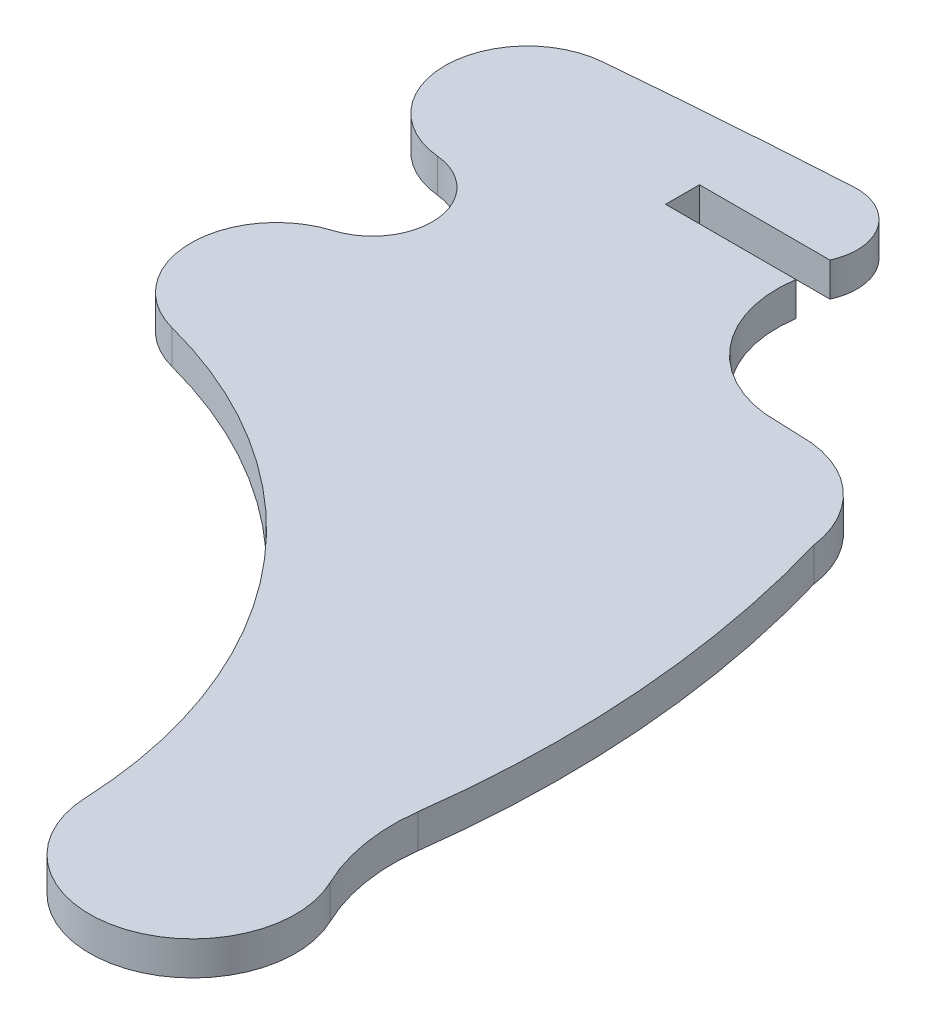
ISO-10303-21;
HEADER;
FILE_DESCRIPTION(('STEP AP214'),'2;1');
FILE_NAME('part.step','',(''),(''),'','','');
FILE_SCHEMA(('AUTOMOTIVE_DESIGN { 1 0 10303 214 1 1 1 1 }'));
ENDSEC;
DATA;
#1=APPLICATION_CONTEXT('core data for automotive mechanical design processes');
#2=APPLICATION_PROTOCOL_DEFINITION('international standard','automotive_design',2000,#1);
#3=PRODUCT_CONTEXT('',#1,'mechanical');
#4=PRODUCT('Part','Part','',(#3));
#5=PRODUCT_RELATED_PRODUCT_CATEGORY('part','',(#4));
#6=PRODUCT_DEFINITION_FORMATION('','',#4);
#7=PRODUCT_DEFINITION_CONTEXT('part definition',#1,'design');
#8=PRODUCT_DEFINITION('design','',#6,#7);
#9=PRODUCT_DEFINITION_SHAPE('','',#8);
#10=(LENGTH_UNIT() NAMED_UNIT(*) SI_UNIT(.MILLI.,.METRE.));
#11=(NAMED_UNIT(*) PLANE_ANGLE_UNIT() SI_UNIT($,.RADIAN.));
#12=(NAMED_UNIT(*) SI_UNIT($,.STERADIAN.) SOLID_ANGLE_UNIT());
#13=UNCERTAINTY_MEASURE_WITH_UNIT(LENGTH_MEASURE(1.E-05),#10,'distance_accuracy_value','');
#14=(GEOMETRIC_REPRESENTATION_CONTEXT(3) GLOBAL_UNCERTAINTY_ASSIGNED_CONTEXT((#13)) GLOBAL_UNIT_ASSIGNED_CONTEXT((#10,
#11,#12)) REPRESENTATION_CONTEXT('',''));
#15=CARTESIAN_POINT('',(0.,0.,0.));
#16=DIRECTION('',(0.,0.,1.));
#17=DIRECTION('',(1.,0.,0.));
#18=AXIS2_PLACEMENT_3D('',#15,#16,#17);
#19=CARTESIAN_POINT('',(-41930.5782253417,3.,-18255.2247567297));
#20=DIRECTION('',(0.,-1.,0.));
#21=DIRECTION('',(0.,0.,-1.));
#22=AXIS2_PLACEMENT_3D('',#19,#20,#21);
#23=CYLINDRICAL_SURFACE('',#22,4.69438040440287);
#24=CARTESIAN_POINT('',(-41930.5782253417,0.,-18255.2247567297));
#25=DIRECTION('',(0.,1.,0.));
#26=DIRECTION('',(0.,0.,1.));
#27=AXIS2_PLACEMENT_3D('',#24,#25,#26);
#28=CIRCLE('',#27,4.69438040440287);
#29=CARTESIAN_POINT('',(-41926.320312,0.,-18253.248047));
#30=VERTEX_POINT('',#29);
#31=CARTESIAN_POINT('',(-41930.847201,0.,-18259.9114250001));
#32=VERTEX_POINT('',#31);
#33=EDGE_CURVE('E173',#30,#32,#28,.T.);
#34=ORIENTED_EDGE('',*,*,#33,.T.);
#35=DIRECTION('',(0.,-1.,0.));
#36=VECTOR('',#35,1.);
#37=CARTESIAN_POINT('',(-41930.847201,3.,-18259.9114250001));
#38=LINE('',#37,#36);
#39=CARTESIAN_POINT('',(-41930.847201,3.,-18259.9114250001));
#40=VERTEX_POINT('',#39);
#41=EDGE_CURVE('E11',#40,#32,#38,.T.);
#42=ORIENTED_EDGE('',*,*,#41,.F.);
#43=CARTESIAN_POINT('',(-41930.5782253417,3.,-18255.2247567297));
#44=DIRECTION('',(0.,1.,0.));
#45=DIRECTION('',(0.,0.,1.));
#46=AXIS2_PLACEMENT_3D('',#43,#44,#45);
#47=CIRCLE('',#46,4.69438040440287);
#48=CARTESIAN_POINT('',(-41926.320312,3.,-18253.248047));
#49=VERTEX_POINT('',#48);
#50=EDGE_CURVE('E201',#49,#40,#47,.T.);
#51=ORIENTED_EDGE('',*,*,#50,.F.);
#52=DIRECTION('',(0.,-1.,0.));
#53=VECTOR('',#52,1.);
#54=CARTESIAN_POINT('',(-41926.320312,3.,-18253.248047));
#55=LINE('',#54,#53);
#56=EDGE_CURVE('E169',#49,#30,#55,.T.);
#57=ORIENTED_EDGE('',*,*,#56,.T.);
#58=EDGE_LOOP('',(#34,#42,#51,#57));
#59=FACE_BOUND('',#58,.T.);
#60=ADVANCED_FACE('F35',(#59),#23,.T.);
#61=CARTESIAN_POINT('',(-41892.5390600243,3.,-17595.9492191451));
#62=DIRECTION('',(0.,-1.,0.));
#63=DIRECTION('',(0.,0.,-1.));
#64=AXIS2_PLACEMENT_3D('',#61,#62,#63);
#65=CYLINDRICAL_SURFACE('',#64,665.066406059401);
#66=CARTESIAN_POINT('',(-41892.5390600243,0.,-17595.9492191451));
#67=DIRECTION('',(0.,1.,0.));
#68=DIRECTION('',(0.,0.,1.));
#69=AXIS2_PLACEMENT_3D('',#66,#67,#68);
#70=CIRCLE('',#69,665.066406059401);
#71=CARTESIAN_POINT('',(-41951.6236900002,0.,-18258.385881));
#72=VERTEX_POINT('',#71);
#73=EDGE_CURVE('E176',#32,#72,#70,.T.);
#74=ORIENTED_EDGE('',*,*,#73,.T.);
#75=DIRECTION('',(0.,-1.,0.));
#76=VECTOR('',#75,1.);
#77=CARTESIAN_POINT('',(-41951.6236900002,3.,-18258.385881));
#78=LINE('',#77,#76);
#79=CARTESIAN_POINT('',(-41951.6236900002,3.,-18258.385881));
#80=VERTEX_POINT('',#79);
#81=EDGE_CURVE('E43',#80,#72,#78,.T.);
#82=ORIENTED_EDGE('',*,*,#81,.F.);
#83=CARTESIAN_POINT('',(-41892.5390600243,3.,-17595.9492191451));
#84=DIRECTION('',(0.,1.,0.));
#85=DIRECTION('',(0.,0.,1.));
#86=AXIS2_PLACEMENT_3D('',#83,#84,#85);
#87=CIRCLE('',#86,665.066406059401);
#88=EDGE_CURVE('E115',#40,#80,#87,.T.);
#89=ORIENTED_EDGE('',*,*,#88,.F.);
#90=ORIENTED_EDGE('',*,*,#41,.T.);
#91=EDGE_LOOP('',(#74,#82,#89,#90));
#92=FACE_BOUND('',#91,.T.);
#93=ADVANCED_FACE('F294',(#92),#65,.T.);
#94=CARTESIAN_POINT('',(-41950.9765596597,3.,-18251.1102450036));
#95=DIRECTION('',(0.,-1.,0.));
#96=DIRECTION('',(0.,0.,-1.));
#97=AXIS2_PLACEMENT_3D('',#94,#95,#96);
#98=CYLINDRICAL_SURFACE('',#97,7.30435875549886);
#99=CARTESIAN_POINT('',(-41950.9765596597,0.,-18251.1102450036));
#100=DIRECTION('',(0.,1.,0.));
#101=DIRECTION('',(0.,0.,1.));
#102=AXIS2_PLACEMENT_3D('',#99,#100,#101);
#103=CIRCLE('',#102,7.30435875549886);
#104=CARTESIAN_POINT('',(-41951.662825,0.,-18243.8381959999));
#105=VERTEX_POINT('',#104);
#106=EDGE_CURVE('E178',#72,#105,#103,.T.);
#107=ORIENTED_EDGE('',*,*,#106,.T.);
#108=DIRECTION('',(0.,-1.,0.));
#109=VECTOR('',#108,1.);
#110=CARTESIAN_POINT('',(-41951.662825,3.,-18243.8381959999));
#111=LINE('',#110,#109);
#112=CARTESIAN_POINT('',(-41951.662825,3.,-18243.8381959999));
#113=VERTEX_POINT('',#112);
#114=EDGE_CURVE('E229',#113,#105,#111,.T.);
#115=ORIENTED_EDGE('',*,*,#114,.F.);
#116=CARTESIAN_POINT('',(-41950.9765596597,3.,-18251.1102450036));
#117=DIRECTION('',(0.,1.,0.));
#118=DIRECTION('',(0.,0.,1.));
#119=AXIS2_PLACEMENT_3D('',#116,#117,#118);
#120=CIRCLE('',#119,7.30435875549886);
#121=EDGE_CURVE('E237',#80,#113,#120,.T.);
#122=ORIENTED_EDGE('',*,*,#121,.F.);
#123=ORIENTED_EDGE('',*,*,#81,.T.);
#124=EDGE_LOOP('',(#107,#115,#122,#123));
#125=FACE_BOUND('',#124,.T.);
#126=ADVANCED_FACE('F235',(#125),#98,.T.);
#127=CARTESIAN_POINT('',(-41952.1601470307,3.,-18238.5604603323));
#128=DIRECTION('',(0.,-1.,0.));
#129=DIRECTION('',(0.,0.,-1.));
#130=AXIS2_PLACEMENT_3D('',#127,#128,#129);
#131=CYLINDRICAL_SURFACE('',#130,5.30111525815377);
#132=CARTESIAN_POINT('',(-41952.1601470307,0.,-18238.5604603323));
#133=DIRECTION('',(0.,-1.,0.));
#134=DIRECTION('',(0.,0.,1.));
#135=AXIS2_PLACEMENT_3D('',#132,#133,#134);
#136=CIRCLE('',#135,5.30111525815377);
#137=CARTESIAN_POINT('',(-41950.592544,0.,-18233.496426));
#138=VERTEX_POINT('',#137);
#139=EDGE_CURVE('E180',#105,#138,#136,.T.);
#140=ORIENTED_EDGE('',*,*,#139,.T.);
#141=DIRECTION('',(0.,-1.,0.));
#142=VECTOR('',#141,1.);
#143=CARTESIAN_POINT('',(-41950.592544,3.,-18233.496426));
#144=LINE('',#143,#142);
#145=CARTESIAN_POINT('',(-41950.592544,3.,-18233.496426));
#146=VERTEX_POINT('',#145);
#147=EDGE_CURVE('E226',#146,#138,#144,.T.);
#148=ORIENTED_EDGE('',*,*,#147,.F.);
#149=CARTESIAN_POINT('',(-41952.1601470307,3.,-18238.5604603323));
#150=DIRECTION('',(0.,-1.,0.));
#151=DIRECTION('',(0.,0.,1.));
#152=AXIS2_PLACEMENT_3D('',#149,#150,#151);
#153=CIRCLE('',#152,5.30111525815377);
#154=EDGE_CURVE('E255',#113,#146,#153,.T.);
#155=ORIENTED_EDGE('',*,*,#154,.F.);
#156=ORIENTED_EDGE('',*,*,#114,.T.);
#157=EDGE_LOOP('',(#140,#148,#155,#156));
#158=FACE_BOUND('',#157,.T.);
#159=ADVANCED_FACE('F246',(#158),#131,.F.);
#160=CARTESIAN_POINT('',(-41948.3554161134,3.,-18226.2534466507));
#161=DIRECTION('',(0.,-1.,0.));
#162=DIRECTION('',(0.,0.,-1.));
#163=AXIS2_PLACEMENT_3D('',#160,#161,#162);
#164=CYLINDRICAL_SURFACE('',#163,7.58059964880303);
#165=CARTESIAN_POINT('',(-41948.3554161134,0.,-18226.2534466507));
#166=DIRECTION('',(0.,1.,0.));
#167=DIRECTION('',(0.,0.,1.));
#168=AXIS2_PLACEMENT_3D('',#165,#166,#167);
#169=CIRCLE('',#168,7.58059964880303);
#170=CARTESIAN_POINT('',(-41950.272967,0.,-18218.919383));
#171=VERTEX_POINT('',#170);
#172=EDGE_CURVE('E182',#138,#171,#169,.T.);
#173=ORIENTED_EDGE('',*,*,#172,.T.);
#174=DIRECTION('',(0.,-1.,0.));
#175=VECTOR('',#174,1.);
#176=CARTESIAN_POINT('',(-41950.272967,3.,-18218.919383));
#177=LINE('',#176,#175);
#178=CARTESIAN_POINT('',(-41950.272967,3.,-18218.919383));
#179=VERTEX_POINT('',#178);
#180=EDGE_CURVE('E223',#179,#171,#177,.T.);
#181=ORIENTED_EDGE('',*,*,#180,.F.);
#182=CARTESIAN_POINT('',(-41948.3554161134,3.,-18226.2534466507));
#183=DIRECTION('',(0.,1.,0.));
#184=DIRECTION('',(0.,0.,1.));
#185=AXIS2_PLACEMENT_3D('',#182,#183,#184);
#186=CIRCLE('',#185,7.58059964880303);
#187=EDGE_CURVE('E252',#146,#179,#186,.T.);
#188=ORIENTED_EDGE('',*,*,#187,.F.);
#189=ORIENTED_EDGE('',*,*,#147,.T.);
#190=EDGE_LOOP('',(#173,#181,#188,#189));
#191=FACE_BOUND('',#190,.T.);
#192=ADVANCED_FACE('F250',(#191),#164,.T.);
#193=CARTESIAN_POINT('',(-41961.1957392201,3.,-18177.117716044));
#194=DIRECTION('',(0.,-1.,0.));
#195=DIRECTION('',(0.,0.,-1.));
#196=AXIS2_PLACEMENT_3D('',#193,#194,#195);
#197=CYLINDRICAL_SURFACE('',#196,43.205165354029);
#198=CARTESIAN_POINT('',(-41961.1957392201,0.,-18177.117716044));
#199=DIRECTION('',(0.,-1.,0.));
#200=DIRECTION('',(0.,0.,1.));
#201=AXIS2_PLACEMENT_3D('',#198,#199,#200);
#202=CIRCLE('',#201,43.205165354029);
#203=CARTESIAN_POINT('',(-41918.0313,0.,-18178.9932159999));
#204=VERTEX_POINT('',#203);
#205=EDGE_CURVE('E184',#171,#204,#202,.T.);
#206=ORIENTED_EDGE('',*,*,#205,.T.);
#207=DIRECTION('',(0.,-1.,0.));
#208=VECTOR('',#207,1.);
#209=CARTESIAN_POINT('',(-41918.0313,3.,-18178.9932159999));
#210=LINE('',#209,#208);
#211=CARTESIAN_POINT('',(-41918.0313,3.,-18178.9932159999));
#212=VERTEX_POINT('',#211);
#213=EDGE_CURVE('E220',#212,#204,#210,.T.);
#214=ORIENTED_EDGE('',*,*,#213,.F.);
#215=CARTESIAN_POINT('',(-41961.1957392201,3.,-18177.117716044));
#216=DIRECTION('',(0.,-1.,0.));
#217=DIRECTION('',(0.,0.,1.));
#218=AXIS2_PLACEMENT_3D('',#215,#216,#217);
#219=CIRCLE('',#218,43.205165354029);
#220=EDGE_CURVE('E254',#179,#212,#219,.T.);
#221=ORIENTED_EDGE('',*,*,#220,.F.);
#222=ORIENTED_EDGE('',*,*,#180,.T.);
#223=EDGE_LOOP('',(#206,#214,#221,#222));
#224=FACE_BOUND('',#223,.T.);
#225=ADVANCED_FACE('F307',(#224),#197,.F.);
#226=CARTESIAN_POINT('',(-41908.9145440623,3.,-18179.388550465));
#227=DIRECTION('',(0.,-1.,0.));
#228=DIRECTION('',(0.,0.,-1.));
#229=AXIS2_PLACEMENT_3D('',#226,#227,#228);
#230=CYLINDRICAL_SURFACE('',#229,9.12532345549994);
#231=CARTESIAN_POINT('',(-41908.9145440623,0.,-18179.388550465));
#232=DIRECTION('',(0.,1.,0.));
#233=DIRECTION('',(0.,0.,1.));
#234=AXIS2_PLACEMENT_3D('',#231,#232,#233);
#235=CIRCLE('',#234,9.12532345549994);
#236=CARTESIAN_POINT('',(-41900.700055,0.,-18183.362679));
#237=VERTEX_POINT('',#236);
#238=EDGE_CURVE('E186',#204,#237,#235,.T.);
#239=ORIENTED_EDGE('',*,*,#238,.T.);
#240=DIRECTION('',(0.,-1.,0.));
#241=VECTOR('',#240,1.);
#242=CARTESIAN_POINT('',(-41900.700055,3.,-18183.362679));
#243=LINE('',#242,#241);
#244=CARTESIAN_POINT('',(-41900.700055,3.,-18183.362679));
#245=VERTEX_POINT('',#244);
#246=EDGE_CURVE('E217',#245,#237,#243,.T.);
#247=ORIENTED_EDGE('',*,*,#246,.F.);
#248=CARTESIAN_POINT('',(-41908.9145440623,3.,-18179.388550465));
#249=DIRECTION('',(0.,1.,0.));
#250=DIRECTION('',(0.,0.,1.));
#251=AXIS2_PLACEMENT_3D('',#248,#249,#250);
#252=CIRCLE('',#251,9.12532345549994);
#253=EDGE_CURVE('E257',#212,#245,#252,.T.);
#254=ORIENTED_EDGE('',*,*,#253,.F.);
#255=ORIENTED_EDGE('',*,*,#213,.T.);
#256=EDGE_LOOP('',(#239,#247,#254,#255));
#257=FACE_BOUND('',#256,.T.);
#258=ADVANCED_FACE('F310',(#257),#230,.T.);
#259=CARTESIAN_POINT('',(-41885.6841749905,3.,-18190.6304671861));
#260=DIRECTION('',(0.,-1.,0.));
#261=DIRECTION('',(0.,0.,-1.));
#262=AXIS2_PLACEMENT_3D('',#259,#260,#261);
#263=CYLINDRICAL_SURFACE('',#262,16.6822479773219);
#264=CARTESIAN_POINT('',(-41885.6841749905,0.,-18190.6304671861));
#265=DIRECTION('',(0.,-1.,0.));
#266=DIRECTION('',(0.,0.,1.));
#267=AXIS2_PLACEMENT_3D('',#264,#265,#266);
#268=CIRCLE('',#267,16.6822479773219);
#269=CARTESIAN_POINT('',(-41902.2402229999,0.,-18192.678557));
#270=VERTEX_POINT('',#269);
#271=EDGE_CURVE('E188',#237,#270,#268,.T.);
#272=ORIENTED_EDGE('',*,*,#271,.T.);
#273=DIRECTION('',(0.,-1.,0.));
#274=VECTOR('',#273,1.);
#275=CARTESIAN_POINT('',(-41902.2402229999,3.,-18192.678557));
#276=LINE('',#275,#274);
#277=CARTESIAN_POINT('',(-41902.2402229999,3.,-18192.678557));
#278=VERTEX_POINT('',#277);
#279=EDGE_CURVE('E214',#278,#270,#276,.T.);
#280=ORIENTED_EDGE('',*,*,#279,.F.);
#281=CARTESIAN_POINT('',(-41885.6841749905,3.,-18190.6304671861));
#282=DIRECTION('',(0.,-1.,0.));
#283=DIRECTION('',(0.,0.,1.));
#284=AXIS2_PLACEMENT_3D('',#281,#282,#283);
#285=CIRCLE('',#284,16.6822479773219);
#286=EDGE_CURVE('E263',#245,#278,#285,.T.);
#287=ORIENTED_EDGE('',*,*,#286,.F.);
#288=ORIENTED_EDGE('',*,*,#246,.T.);
#289=EDGE_LOOP('',(#272,#280,#287,#288));
#290=FACE_BOUND('',#289,.T.);
#291=ADVANCED_FACE('F314',(#290),#263,.F.);
#292=CARTESIAN_POINT('',(-41993.7932295786,3.,-18204.7455682775));
#293=DIRECTION('',(0.,-1.,0.));
#294=DIRECTION('',(0.,0.,-1.));
#295=AXIS2_PLACEMENT_3D('',#292,#293,#294);
#296=CYLINDRICAL_SURFACE('',#295,92.3448199671963);
#297=CARTESIAN_POINT('',(-41993.7932295786,0.,-18204.7455682775));
#298=DIRECTION('',(0.,1.,0.));
#299=DIRECTION('',(0.,0.,1.));
#300=AXIS2_PLACEMENT_3D('',#297,#298,#299);
#301=CIRCLE('',#300,92.3448199671963);
#302=CARTESIAN_POINT('',(-41905.170188,0.,-18230.697876));
#303=VERTEX_POINT('',#302);
#304=EDGE_CURVE('E190',#270,#303,#301,.T.);
#305=ORIENTED_EDGE('',*,*,#304,.T.);
#306=DIRECTION('',(0.,-1.,0.));
#307=VECTOR('',#306,1.);
#308=CARTESIAN_POINT('',(-41905.170188,3.,-18230.697876));
#309=LINE('',#308,#307);
#310=CARTESIAN_POINT('',(-41905.170188,3.,-18230.697876));
#311=VERTEX_POINT('',#310);
#312=EDGE_CURVE('E211',#311,#303,#309,.T.);
#313=ORIENTED_EDGE('',*,*,#312,.F.);
#314=CARTESIAN_POINT('',(-41993.7932295786,3.,-18204.7455682775));
#315=DIRECTION('',(0.,1.,0.));
#316=DIRECTION('',(0.,0.,1.));
#317=AXIS2_PLACEMENT_3D('',#314,#315,#316);
#318=CIRCLE('',#317,92.3448199671963);
#319=EDGE_CURVE('E265',#278,#311,#318,.T.);
#320=ORIENTED_EDGE('',*,*,#319,.F.);
#321=ORIENTED_EDGE('',*,*,#279,.T.);
#322=EDGE_LOOP('',(#305,#313,#320,#321));
#323=FACE_BOUND('',#322,.T.);
#324=ADVANCED_FACE('F318',(#323),#296,.T.);
#325=CARTESIAN_POINT('',(-41914.0199248775,3.,-18229.5258886737));
#326=DIRECTION('',(0.,-1.,0.));
#327=DIRECTION('',(0.,0.,-1.));
#328=AXIS2_PLACEMENT_3D('',#325,#326,#327);
#329=CYLINDRICAL_SURFACE('',#328,8.92700381389839);
#330=CARTESIAN_POINT('',(-41914.0199248775,0.,-18229.5258886737));
#331=DIRECTION('',(0.,1.,0.));
#332=DIRECTION('',(0.,0.,1.));
#333=AXIS2_PLACEMENT_3D('',#330,#331,#332);
#334=CIRCLE('',#333,8.92700381389839);
#335=CARTESIAN_POINT('',(-41913.11387,0.,-18238.406793));
#336=VERTEX_POINT('',#335);
#337=EDGE_CURVE('E192',#303,#336,#334,.T.);
#338=ORIENTED_EDGE('',*,*,#337,.T.);
#339=DIRECTION('',(0.,-1.,0.));
#340=VECTOR('',#339,1.);
#341=CARTESIAN_POINT('',(-41913.11387,3.,-18238.406793));
#342=LINE('',#341,#340);
#343=CARTESIAN_POINT('',(-41913.11387,3.,-18238.406793));
#344=VERTEX_POINT('',#343);
#345=EDGE_CURVE('E208',#344,#336,#342,.T.);
#346=ORIENTED_EDGE('',*,*,#345,.F.);
#347=CARTESIAN_POINT('',(-41914.0199248775,3.,-18229.5258886737));
#348=DIRECTION('',(0.,1.,0.));
#349=DIRECTION('',(0.,0.,1.));
#350=AXIS2_PLACEMENT_3D('',#347,#348,#349);
#351=CIRCLE('',#350,8.92700381389839);
#352=EDGE_CURVE('E267',#311,#344,#351,.T.);
#353=ORIENTED_EDGE('',*,*,#352,.F.);
#354=ORIENTED_EDGE('',*,*,#312,.T.);
#355=EDGE_LOOP('',(#338,#346,#353,#354));
#356=FACE_BOUND('',#355,.T.);
#357=ADVANCED_FACE('F322',(#356),#329,.T.);
#358=CARTESIAN_POINT('',(-41913.11387,3.,-18238.406793));
#359=DIRECTION('',(-0.0405453525068657,0.,0.999177699105666));
#360=DIRECTION('',(0.999177699105667,0.,0.0405453525068657));
#361=AXIS2_PLACEMENT_3D('',#358,#359,#360);
#362=PLANE('',#361);
#363=DIRECTION('',(-0.999177699105667,0.,-0.0405453525068657));
#364=VECTOR('',#363,1.);
#365=CARTESIAN_POINT('',(-41913.11387,0.,-18238.406793));
#366=LINE('',#365,#364);
#367=CARTESIAN_POINT('',(-41917.480469,0.,-18238.583984));
#368=VERTEX_POINT('',#367);
#369=EDGE_CURVE('E194',#336,#368,#366,.T.);
#370=ORIENTED_EDGE('',*,*,#369,.T.);
#371=DIRECTION('',(0.,-1.,0.));
#372=VECTOR('',#371,1.);
#373=CARTESIAN_POINT('',(-41917.480469,3.,-18238.583984));
#374=LINE('',#373,#372);
#375=CARTESIAN_POINT('',(-41917.480469,3.,-18238.583984));
#376=VERTEX_POINT('',#375);
#377=EDGE_CURVE('E205',#376,#368,#374,.T.);
#378=ORIENTED_EDGE('',*,*,#377,.F.);
#379=DIRECTION('',(-0.999177699105667,0.,-0.0405453525068657));
#380=VECTOR('',#379,1.);
#381=CARTESIAN_POINT('',(-41913.11387,3.,-18238.406793));
#382=LINE('',#381,#380);
#383=EDGE_CURVE('E269',#344,#376,#382,.T.);
#384=ORIENTED_EDGE('',*,*,#383,.F.);
#385=ORIENTED_EDGE('',*,*,#345,.T.);
#386=EDGE_LOOP('',(#370,#378,#384,#385));
#387=FACE_BOUND('',#386,.T.);
#388=ADVANCED_FACE('F275',(#387),#362,.F.);
#389=CARTESIAN_POINT('',(-41916.2614631244,3.,-18248.693021539));
#390=DIRECTION('',(0.,-1.,0.));
#391=DIRECTION('',(0.,0.,-1.));
#392=AXIS2_PLACEMENT_3D('',#389,#390,#391);
#393=CYLINDRICAL_SURFACE('',#392,10.1822696531761);
#394=CARTESIAN_POINT('',(-41916.2614631244,0.,-18248.693021539));
#395=DIRECTION('',(0.,-1.,0.));
#396=DIRECTION('',(0.,0.,1.));
#397=AXIS2_PLACEMENT_3D('',#394,#395,#396);
#398=CIRCLE('',#397,10.1822696531761);
#399=CARTESIAN_POINT('',(-41926.324344,0.,-18250.247706));
#400=VERTEX_POINT('',#399);
#401=EDGE_CURVE('E196',#368,#400,#398,.T.);
#402=ORIENTED_EDGE('',*,*,#401,.T.);
#403=DIRECTION('',(0.,-1.,0.));
#404=VECTOR('',#403,1.);
#405=CARTESIAN_POINT('',(-41926.324344,3.,-18250.247706));
#406=LINE('',#405,#404);
#407=CARTESIAN_POINT('',(-41926.324344,3.,-18250.247706));
#408=VERTEX_POINT('',#407);
#409=EDGE_CURVE('E164',#408,#400,#406,.T.);
#410=ORIENTED_EDGE('',*,*,#409,.F.);
#411=CARTESIAN_POINT('',(-41916.2614631244,3.,-18248.693021539));
#412=DIRECTION('',(0.,-1.,0.));
#413=DIRECTION('',(0.,0.,1.));
#414=AXIS2_PLACEMENT_3D('',#411,#412,#413);
#415=CIRCLE('',#414,10.1822696531761);
#416=EDGE_CURVE('E155',#376,#408,#415,.T.);
#417=ORIENTED_EDGE('',*,*,#416,.F.);
#418=ORIENTED_EDGE('',*,*,#377,.T.);
#419=EDGE_LOOP('',(#402,#410,#417,#418));
#420=FACE_BOUND('',#419,.T.);
#421=ADVANCED_FACE('F279',(#420),#393,.F.);
#422=CARTESIAN_POINT('',(-41926.324344,3.,-18250.247706));
#423=DIRECTION('',(0.000139606377555394,0.,0.99999999025503));
#424=DIRECTION('',(0.99999999025503,0.,-0.000139606377555394));
#425=AXIS2_PLACEMENT_3D('',#422,#423,#424);
#426=PLANE('',#425);
#427=DIRECTION('',(-0.99999999025503,0.,0.000139606377555394));
#428=VECTOR('',#427,1.);
#429=CARTESIAN_POINT('',(-41926.324344,0.,-18250.247706));
#430=LINE('',#429,#428);
#431=CARTESIAN_POINT('',(-41937.871094,0.,-18250.246094));
#432=VERTEX_POINT('',#431);
#433=EDGE_CURVE('E163',#400,#432,#430,.T.);
#434=ORIENTED_EDGE('',*,*,#433,.T.);
#435=DIRECTION('',(0.,-1.,0.));
#436=VECTOR('',#435,1.);
#437=CARTESIAN_POINT('',(-41937.871094,3.,-18250.246094));
#438=LINE('',#437,#436);
#439=CARTESIAN_POINT('',(-41937.871094,3.,-18250.246094));
#440=VERTEX_POINT('',#439);
#441=EDGE_CURVE('E160',#440,#432,#438,.T.);
#442=ORIENTED_EDGE('',*,*,#441,.F.);
#443=DIRECTION('',(-0.99999999025503,0.,0.000139606377555394));
#444=VECTOR('',#443,1.);
#445=CARTESIAN_POINT('',(-41926.324344,3.,-18250.247706));
#446=LINE('',#445,#444);
#447=EDGE_CURVE('E149',#408,#440,#446,.T.);
#448=ORIENTED_EDGE('',*,*,#447,.F.);
#449=ORIENTED_EDGE('',*,*,#409,.T.);
#450=EDGE_LOOP('',(#434,#442,#448,#449));
#451=FACE_BOUND('',#450,.T.);
#452=ADVANCED_FACE('F161',(#451),#426,.F.);
#453=CARTESIAN_POINT('',(-41937.871094,3.,-18250.246094));
#454=DIRECTION('',(-1.,0.,0.));
#455=DIRECTION('',(0.,0.,1.));
#456=AXIS2_PLACEMENT_3D('',#453,#454,#455);
#457=PLANE('',#456);
#458=DIRECTION('',(0.,0.,-1.));
#459=VECTOR('',#458,1.);
#460=CARTESIAN_POINT('',(-41937.871094,0.,-18250.246094));
#461=LINE('',#460,#459);
#462=CARTESIAN_POINT('',(-41937.871094,0.,-18253.248047));
#463=VERTEX_POINT('',#462);
#464=EDGE_CURVE('E101',#432,#463,#461,.T.);
#465=ORIENTED_EDGE('',*,*,#464,.T.);
#466=DIRECTION('',(0.,-1.,0.));
#467=VECTOR('',#466,1.);
#468=CARTESIAN_POINT('',(-41937.871094,3.,-18253.248047));
#469=LINE('',#468,#467);
#470=CARTESIAN_POINT('',(-41937.871094,3.,-18253.248047));
#471=VERTEX_POINT('',#470);
#472=EDGE_CURVE('E165',#471,#463,#469,.T.);
#473=ORIENTED_EDGE('',*,*,#472,.F.);
#474=DIRECTION('',(0.,0.,-1.));
#475=VECTOR('',#474,1.);
#476=CARTESIAN_POINT('',(-41937.871094,3.,-18250.246094));
#477=LINE('',#476,#475);
#478=EDGE_CURVE('E153',#440,#471,#477,.T.);
#479=ORIENTED_EDGE('',*,*,#478,.F.);
#480=ORIENTED_EDGE('',*,*,#441,.T.);
#481=EDGE_LOOP('',(#465,#473,#479,#480));
#482=FACE_BOUND('',#481,.T.);
#483=ADVANCED_FACE('F167',(#482),#457,.F.);
#484=CARTESIAN_POINT('',(-41937.871094,3.,-18253.248047));
#485=DIRECTION('',(0.,0.,-1.));
#486=DIRECTION('',(-1.,0.,0.));
#487=AXIS2_PLACEMENT_3D('',#484,#485,#486);
#488=PLANE('',#487);
#489=DIRECTION('',(1.,0.,0.));
#490=VECTOR('',#489,1.);
#491=CARTESIAN_POINT('',(-41937.871094,0.,-18253.248047));
#492=LINE('',#491,#490);
#493=EDGE_CURVE('E107',#463,#30,#492,.T.);
#494=ORIENTED_EDGE('',*,*,#493,.T.);
#495=ORIENTED_EDGE('',*,*,#56,.F.);
#496=DIRECTION('',(1.,0.,0.));
#497=VECTOR('',#496,1.);
#498=CARTESIAN_POINT('',(-41937.871094,3.,-18253.248047));
#499=LINE('',#498,#497);
#500=EDGE_CURVE('E51',#471,#49,#499,.T.);
#501=ORIENTED_EDGE('',*,*,#500,.F.);
#502=ORIENTED_EDGE('',*,*,#472,.T.);
#503=EDGE_LOOP('',(#494,#495,#501,#502));
#504=FACE_BOUND('',#503,.T.);
#505=ADVANCED_FACE('F283',(#504),#488,.F.);
#506=CARTESIAN_POINT('',(-41930.5782253417,3.,-18255.2247567297));
#507=DIRECTION('',(0.,1.,0.));
#508=DIRECTION('',(0.,0.,1.));
#509=AXIS2_PLACEMENT_3D('',#506,#507,#508);
#510=PLANE('',#509);
#511=ORIENTED_EDGE('',*,*,#50,.T.);
#512=ORIENTED_EDGE('',*,*,#88,.T.);
#513=ORIENTED_EDGE('',*,*,#121,.T.);
#514=ORIENTED_EDGE('',*,*,#154,.T.);
#515=ORIENTED_EDGE('',*,*,#187,.T.);
#516=ORIENTED_EDGE('',*,*,#220,.T.);
#517=ORIENTED_EDGE('',*,*,#253,.T.);
#518=ORIENTED_EDGE('',*,*,#286,.T.);
#519=ORIENTED_EDGE('',*,*,#319,.T.);
#520=ORIENTED_EDGE('',*,*,#352,.T.);
#521=ORIENTED_EDGE('',*,*,#383,.T.);
#522=ORIENTED_EDGE('',*,*,#416,.T.);
#523=ORIENTED_EDGE('',*,*,#447,.T.);
#524=ORIENTED_EDGE('',*,*,#478,.T.);
#525=ORIENTED_EDGE('',*,*,#500,.T.);
#526=EDGE_LOOP('',(#511,#512,#513,#514,#515,#516,#517,#518,#519,#520,#521,#522,#523,#524,#525));
#527=FACE_BOUND('',#526,.T.);
#528=ADVANCED_FACE('F151',(#527),#510,.T.);
#529=CARTESIAN_POINT('',(-41930.5782253417,0.,-18255.2247567297));
#530=DIRECTION('',(0.,1.,0.));
#531=DIRECTION('',(0.,0.,1.));
#532=AXIS2_PLACEMENT_3D('',#529,#530,#531);
#533=PLANE('',#532);
#534=ORIENTED_EDGE('',*,*,#33,.F.);
#535=ORIENTED_EDGE('',*,*,#493,.F.);
#536=ORIENTED_EDGE('',*,*,#464,.F.);
#537=ORIENTED_EDGE('',*,*,#433,.F.);
#538=ORIENTED_EDGE('',*,*,#401,.F.);
#539=ORIENTED_EDGE('',*,*,#369,.F.);
#540=ORIENTED_EDGE('',*,*,#337,.F.);
#541=ORIENTED_EDGE('',*,*,#304,.F.);
#542=ORIENTED_EDGE('',*,*,#271,.F.);
#543=ORIENTED_EDGE('',*,*,#238,.F.);
#544=ORIENTED_EDGE('',*,*,#205,.F.);
#545=ORIENTED_EDGE('',*,*,#172,.F.);
#546=ORIENTED_EDGE('',*,*,#139,.F.);
#547=ORIENTED_EDGE('',*,*,#106,.F.);
#548=ORIENTED_EDGE('',*,*,#73,.F.);
#549=EDGE_LOOP('',(#534,#535,#536,#537,#538,#539,#540,#541,#542,#543,#544,#545,#546,#547,#548));
#550=FACE_BOUND('',#549,.T.);
#551=ADVANCED_FACE('F241',(#550),#533,.F.);
#552=CLOSED_SHELL('',(#60,#93,#126,#159,#192,#225,#258,#291,#324,#357,#388,#421,#452,#483,#505,
#528,#551));
#553=MANIFOLD_SOLID_BREP('B2',#552);
#554=ADVANCED_BREP_SHAPE_REPRESENTATION('',(#18,#553),#14);
#555=SHAPE_DEFINITION_REPRESENTATION(#9,#554);
ENDSEC;
END-ISO-10303-21;
